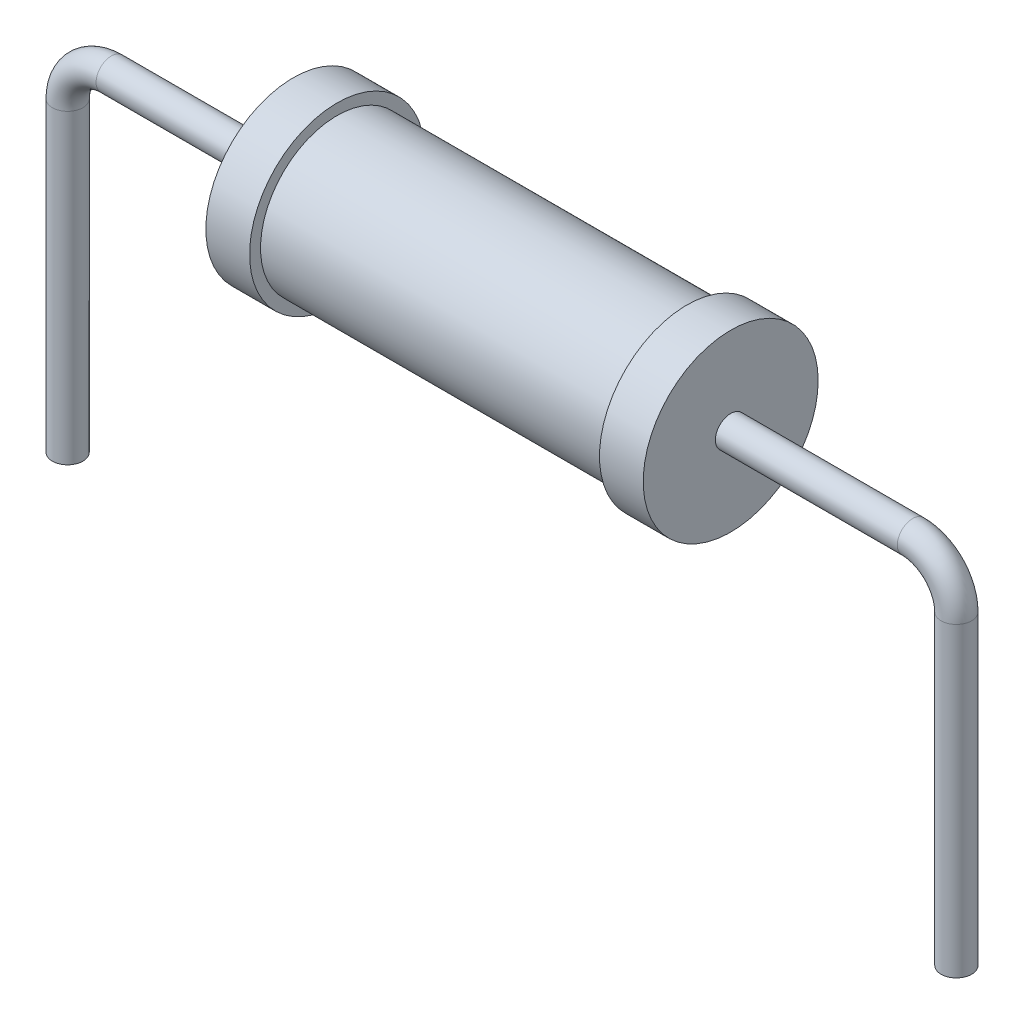
ISO-10303-21;
HEADER;
FILE_DESCRIPTION(('STEP AP214'),'2;1');
FILE_NAME('part.step','',(''),(''),'','','');
FILE_SCHEMA(('AUTOMOTIVE_DESIGN { 1 0 10303 214 1 1 1 1 }'));
ENDSEC;
DATA;
#1=APPLICATION_CONTEXT('core data for automotive mechanical design processes');
#2=APPLICATION_PROTOCOL_DEFINITION('international standard','automotive_design',2000,#1);
#3=PRODUCT_CONTEXT('',#1,'mechanical');
#4=PRODUCT('Part','Part','',(#3));
#5=PRODUCT_RELATED_PRODUCT_CATEGORY('part','',(#4));
#6=PRODUCT_DEFINITION_FORMATION('','',#4);
#7=PRODUCT_DEFINITION_CONTEXT('part definition',#1,'design');
#8=PRODUCT_DEFINITION('design','',#6,#7);
#9=PRODUCT_DEFINITION_SHAPE('','',#8);
#10=(LENGTH_UNIT() NAMED_UNIT(*) SI_UNIT(.MILLI.,.METRE.));
#11=(NAMED_UNIT(*) PLANE_ANGLE_UNIT() SI_UNIT($,.RADIAN.));
#12=(NAMED_UNIT(*) SI_UNIT($,.STERADIAN.) SOLID_ANGLE_UNIT());
#13=UNCERTAINTY_MEASURE_WITH_UNIT(LENGTH_MEASURE(1.E-05),#10,'distance_accuracy_value','');
#14=(GEOMETRIC_REPRESENTATION_CONTEXT(3) GLOBAL_UNCERTAINTY_ASSIGNED_CONTEXT((#13)) GLOBAL_UNIT_ASSIGNED_CONTEXT((#10,
#11,#12)) REPRESENTATION_CONTEXT('',''));
#15=CARTESIAN_POINT('',(0.,0.,0.));
#16=DIRECTION('',(0.,0.,1.));
#17=DIRECTION('',(1.,0.,0.));
#18=AXIS2_PLACEMENT_3D('',#15,#16,#17);
#19=CARTESIAN_POINT('',(5.,0.,0.));
#20=DIRECTION('',(-1.,0.,0.));
#21=DIRECTION('',(0.,0.,1.));
#22=AXIS2_PLACEMENT_3D('',#19,#20,#21);
#23=CYLINDRICAL_SURFACE('',#22,2.);
#24=CARTESIAN_POINT('',(-5.,0.,0.));
#25=DIRECTION('',(1.,0.,0.));
#26=DIRECTION('',(0.,0.,-1.));
#27=AXIS2_PLACEMENT_3D('',#24,#25,#26);
#28=CIRCLE('',#27,2.);
#29=CARTESIAN_POINT('',(-5.,0.,-2.));
#30=VERTEX_POINT('',#29);
#31=EDGE_CURVE('E81',#30,#30,#28,.T.);
#32=ORIENTED_EDGE('',*,*,#31,.T.);
#33=EDGE_LOOP('',(#32));
#34=FACE_BOUND('',#33,.T.);
#35=CARTESIAN_POINT('',(-4.,0.,0.));
#36=DIRECTION('',(1.,0.,0.));
#37=DIRECTION('',(0.,0.,-1.));
#38=AXIS2_PLACEMENT_3D('',#35,#36,#37);
#39=CIRCLE('',#38,2.);
#40=CARTESIAN_POINT('',(-4.,0.,-2.));
#41=VERTEX_POINT('',#40);
#42=EDGE_CURVE('E45',#41,#41,#39,.T.);
#43=ORIENTED_EDGE('',*,*,#42,.F.);
#44=EDGE_LOOP('',(#43));
#45=FACE_BOUND('',#44,.T.);
#46=ADVANCED_FACE('F41',(#34,#45),#23,.T.);
#47=CARTESIAN_POINT('',(-5.,0.,0.));
#48=DIRECTION('',(-1.,0.,0.));
#49=DIRECTION('',(0.,0.,-1.));
#50=AXIS2_PLACEMENT_3D('',#47,#48,#49);
#51=PLANE('',#50);
#52=CARTESIAN_POINT('',(-5.,0.,0.));
#53=DIRECTION('',(-1.,0.,0.));
#54=DIRECTION('',(0.,0.,1.));
#55=AXIS2_PLACEMENT_3D('',#52,#53,#54);
#56=CIRCLE('',#55,0.35);
#57=CARTESIAN_POINT('',(-5.,0.,0.35));
#58=VERTEX_POINT('',#57);
#59=EDGE_CURVE('E11',#58,#58,#56,.T.);
#60=ORIENTED_EDGE('',*,*,#59,.F.);
#61=EDGE_LOOP('',(#60));
#62=FACE_BOUND('',#61,.T.);
#63=ORIENTED_EDGE('',*,*,#31,.F.);
#64=EDGE_LOOP('',(#63));
#65=FACE_BOUND('',#64,.T.);
#66=ADVANCED_FACE('F105',(#62,#65),#51,.T.);
#67=CARTESIAN_POINT('',(-10.16,-0.999999999999999,0.));
#68=DIRECTION('',(0.,-1.,0.));
#69=DIRECTION('',(0.,0.,-1.));
#70=AXIS2_PLACEMENT_3D('',#67,#68,#69);
#71=CYLINDRICAL_SURFACE('',#70,0.35);
#72=CARTESIAN_POINT('',(-10.16,-0.999999999999999,0.));
#73=DIRECTION('',(0.,1.,0.));
#74=DIRECTION('',(0.,0.,-1.));
#75=AXIS2_PLACEMENT_3D('',#72,#73,#74);
#76=CIRCLE('',#75,0.35);
#77=CARTESIAN_POINT('',(-10.51,-0.999999999999999,0.));
#78=VERTEX_POINT('',#77);
#79=EDGE_CURVE('E75',#78,#78,#76,.T.);
#80=ORIENTED_EDGE('',*,*,#79,.F.);
#81=EDGE_LOOP('',(#80));
#82=FACE_BOUND('',#81,.T.);
#83=CARTESIAN_POINT('',(-10.16,-8.,0.));
#84=DIRECTION('',(0.,1.,0.));
#85=DIRECTION('',(0.,0.,-1.));
#86=AXIS2_PLACEMENT_3D('',#83,#84,#85);
#87=CIRCLE('',#86,0.35);
#88=CARTESIAN_POINT('',(-10.16,-8.,-0.35));
#89=VERTEX_POINT('',#88);
#90=EDGE_CURVE('E78',#89,#89,#87,.T.);
#91=ORIENTED_EDGE('',*,*,#90,.T.);
#92=EDGE_LOOP('',(#91));
#93=FACE_BOUND('',#92,.T.);
#94=ADVANCED_FACE('F110',(#82,#93),#71,.T.);
#95=CARTESIAN_POINT('',(-9.16,-1.,0.));
#96=DIRECTION('',(0.,0.,1.));
#97=DIRECTION('',(1.,0.,0.));
#98=AXIS2_PLACEMENT_3D('',#95,#96,#97);
#99=TOROIDAL_SURFACE('',#98,1.,0.35);
#100=CARTESIAN_POINT('',(-9.16,0.,0.));
#101=DIRECTION('',(1.,0.,0.));
#102=DIRECTION('',(0.,0.,-1.));
#103=AXIS2_PLACEMENT_3D('',#100,#101,#102);
#104=CIRCLE('',#103,0.35);
#105=CARTESIAN_POINT('',(-9.16,0.35,0.));
#106=VERTEX_POINT('',#105);
#107=EDGE_CURVE('E64',#106,#106,#104,.T.);
#108=CARTESIAN_POINT('',(-9.16,-1.,0.));
#109=DIRECTION('',(0.,0.,1.));
#110=DIRECTION('',(1.,0.,0.));
#111=AXIS2_PLACEMENT_3D('',#108,#109,#110);
#112=CIRCLE('',#111,1.35);
#113=EDGE_CURVE('',#106,#78,#112,.T.);
#114=ORIENTED_EDGE('',*,*,#107,.F.);
#115=ORIENTED_EDGE('',*,*,#79,.T.);
#116=ORIENTED_EDGE('',*,*,#113,.T.);
#117=ORIENTED_EDGE('',*,*,#113,.F.);
#118=EDGE_LOOP('',(#114,#116,#115,#117));
#119=FACE_BOUND('',#118,.T.);
#120=ADVANCED_FACE('F137',(#119),#99,.T.);
#121=CARTESIAN_POINT('',(-9.16,0.,0.));
#122=DIRECTION('',(1.,0.,0.));
#123=DIRECTION('',(0.,0.,-1.));
#124=AXIS2_PLACEMENT_3D('',#121,#122,#123);
#125=CYLINDRICAL_SURFACE('',#124,0.35);
#126=ORIENTED_EDGE('',*,*,#107,.T.);
#127=EDGE_LOOP('',(#126));
#128=FACE_BOUND('',#127,.T.);
#129=ORIENTED_EDGE('',*,*,#59,.T.);
#130=EDGE_LOOP('',(#129));
#131=FACE_BOUND('',#130,.T.);
#132=ADVANCED_FACE('F130',(#128,#131),#125,.T.);
#133=CARTESIAN_POINT('',(-10.16,-8.,0.));
#134=DIRECTION('',(0.,-1.,0.));
#135=DIRECTION('',(0.,0.,-1.));
#136=AXIS2_PLACEMENT_3D('',#133,#134,#135);
#137=PLANE('',#136);
#138=ORIENTED_EDGE('',*,*,#90,.F.);
#139=EDGE_LOOP('',(#138));
#140=FACE_BOUND('',#139,.T.);
#141=ADVANCED_FACE('F120',(#140),#137,.T.);
#142=CARTESIAN_POINT('',(-4.,0.,0.));
#143=DIRECTION('',(1.,0.,0.));
#144=DIRECTION('',(0.,0.,-1.));
#145=AXIS2_PLACEMENT_3D('',#142,#143,#144);
#146=PLANE('',#145);
#147=CARTESIAN_POINT('',(-4.,0.,0.));
#148=DIRECTION('',(1.,0.,0.));
#149=DIRECTION('',(0.,0.,-1.));
#150=AXIS2_PLACEMENT_3D('',#147,#148,#149);
#151=CIRCLE('',#150,1.75);
#152=CARTESIAN_POINT('',(-4.,0.,-1.75));
#153=VERTEX_POINT('',#152);
#154=EDGE_CURVE('E60',#153,#153,#151,.T.);
#155=ORIENTED_EDGE('',*,*,#154,.F.);
#156=EDGE_LOOP('',(#155));
#157=FACE_BOUND('',#156,.T.);
#158=ORIENTED_EDGE('',*,*,#42,.T.);
#159=EDGE_LOOP('',(#158));
#160=FACE_BOUND('',#159,.T.);
#161=ADVANCED_FACE('F117',(#157,#160),#146,.T.);
#162=CARTESIAN_POINT('',(4.,0.,0.));
#163=DIRECTION('',(1.,0.,0.));
#164=DIRECTION('',(0.,0.,-1.));
#165=AXIS2_PLACEMENT_3D('',#162,#163,#164);
#166=PLANE('',#165);
#167=CARTESIAN_POINT('',(4.,0.,0.));
#168=DIRECTION('',(1.,0.,0.));
#169=DIRECTION('',(0.,0.,-1.));
#170=AXIS2_PLACEMENT_3D('',#167,#168,#169);
#171=CIRCLE('',#170,1.75);
#172=CARTESIAN_POINT('',(4.,0.,-1.75));
#173=VERTEX_POINT('',#172);
#174=EDGE_CURVE('E66',#173,#173,#171,.T.);
#175=ORIENTED_EDGE('',*,*,#174,.T.);
#176=EDGE_LOOP('',(#175));
#177=FACE_BOUND('',#176,.T.);
#178=CARTESIAN_POINT('',(4.,0.,0.));
#179=DIRECTION('',(1.,0.,0.));
#180=DIRECTION('',(0.,0.,-1.));
#181=AXIS2_PLACEMENT_3D('',#178,#179,#180);
#182=CIRCLE('',#181,2.);
#183=CARTESIAN_POINT('',(4.,0.,-2.));
#184=VERTEX_POINT('',#183);
#185=EDGE_CURVE('E58',#184,#184,#182,.T.);
#186=ORIENTED_EDGE('',*,*,#185,.F.);
#187=EDGE_LOOP('',(#186));
#188=FACE_BOUND('',#187,.T.);
#189=ADVANCED_FACE('F119',(#177,#188),#166,.F.);
#190=CARTESIAN_POINT('',(-4.,0.,0.));
#191=DIRECTION('',(1.,0.,0.));
#192=DIRECTION('',(0.,0.,-1.));
#193=AXIS2_PLACEMENT_3D('',#190,#191,#192);
#194=CYLINDRICAL_SURFACE('',#193,1.75);
#195=ORIENTED_EDGE('',*,*,#154,.T.);
#196=EDGE_LOOP('',(#195));
#197=FACE_BOUND('',#196,.T.);
#198=ORIENTED_EDGE('',*,*,#174,.F.);
#199=EDGE_LOOP('',(#198));
#200=FACE_BOUND('',#199,.T.);
#201=ADVANCED_FACE('F127',(#197,#200),#194,.T.);
#202=CARTESIAN_POINT('',(10.16,-8.,0.));
#203=DIRECTION('',(0.,-1.,0.));
#204=DIRECTION('',(0.,0.,-1.));
#205=AXIS2_PLACEMENT_3D('',#202,#203,#204);
#206=PLANE('',#205);
#207=CARTESIAN_POINT('',(10.16,-8.,0.));
#208=DIRECTION('',(0.,-1.,0.));
#209=DIRECTION('',(0.,0.,-1.));
#210=AXIS2_PLACEMENT_3D('',#207,#208,#209);
#211=CIRCLE('',#210,0.35);
#212=CARTESIAN_POINT('',(10.16,-8.,-0.35));
#213=VERTEX_POINT('',#212);
#214=EDGE_CURVE('E89',#213,#213,#211,.T.);
#215=ORIENTED_EDGE('',*,*,#214,.T.);
#216=EDGE_LOOP('',(#215));
#217=FACE_BOUND('',#216,.T.);
#218=ADVANCED_FACE('F145',(#217),#206,.T.);
#219=CARTESIAN_POINT('',(10.16,-0.999999999999999,0.));
#220=DIRECTION('',(0.,-1.,0.));
#221=DIRECTION('',(0.,0.,-1.));
#222=AXIS2_PLACEMENT_3D('',#219,#220,#221);
#223=CYLINDRICAL_SURFACE('',#222,0.35);
#224=CARTESIAN_POINT('',(10.16,-0.999999999999999,0.));
#225=DIRECTION('',(0.,-1.,0.));
#226=DIRECTION('',(0.,0.,-1.));
#227=AXIS2_PLACEMENT_3D('',#224,#225,#226);
#228=CIRCLE('',#227,0.35);
#229=CARTESIAN_POINT('',(10.51,-0.999999999999999,0.));
#230=VERTEX_POINT('',#229);
#231=EDGE_CURVE('E86',#230,#230,#228,.T.);
#232=ORIENTED_EDGE('',*,*,#231,.T.);
#233=EDGE_LOOP('',(#232));
#234=FACE_BOUND('',#233,.T.);
#235=ORIENTED_EDGE('',*,*,#214,.F.);
#236=EDGE_LOOP('',(#235));
#237=FACE_BOUND('',#236,.T.);
#238=ADVANCED_FACE('F148',(#234,#237),#223,.T.);
#239=CARTESIAN_POINT('',(9.16,-1.,0.));
#240=DIRECTION('',(0.,0.,-1.));
#241=DIRECTION('',(-1.,0.,0.));
#242=AXIS2_PLACEMENT_3D('',#239,#240,#241);
#243=TOROIDAL_SURFACE('',#242,1.,0.35);
#244=CARTESIAN_POINT('',(9.16,0.,0.));
#245=DIRECTION('',(1.,0.,0.));
#246=DIRECTION('',(0.,0.,-1.));
#247=AXIS2_PLACEMENT_3D('',#244,#245,#246);
#248=CIRCLE('',#247,0.35);
#249=CARTESIAN_POINT('',(9.16,0.35,0.));
#250=VERTEX_POINT('',#249);
#251=EDGE_CURVE('E84',#250,#250,#248,.T.);
#252=CARTESIAN_POINT('',(9.16,-1.,0.));
#253=DIRECTION('',(0.,0.,-1.));
#254=DIRECTION('',(-1.,0.,0.));
#255=AXIS2_PLACEMENT_3D('',#252,#253,#254);
#256=CIRCLE('',#255,1.35);
#257=EDGE_CURVE('',#250,#230,#256,.T.);
#258=ORIENTED_EDGE('',*,*,#251,.T.);
#259=ORIENTED_EDGE('',*,*,#231,.F.);
#260=ORIENTED_EDGE('',*,*,#257,.T.);
#261=ORIENTED_EDGE('',*,*,#257,.F.);
#262=EDGE_LOOP('',(#258,#260,#259,#261));
#263=FACE_BOUND('',#262,.T.);
#264=ADVANCED_FACE('F151',(#263),#243,.T.);
#265=CARTESIAN_POINT('',(9.16,0.,0.));
#266=DIRECTION('',(-1.,0.,0.));
#267=DIRECTION('',(0.,0.,1.));
#268=AXIS2_PLACEMENT_3D('',#265,#266,#267);
#269=CYLINDRICAL_SURFACE('',#268,0.35);
#270=ORIENTED_EDGE('',*,*,#251,.F.);
#271=EDGE_LOOP('',(#270));
#272=FACE_BOUND('',#271,.T.);
#273=CARTESIAN_POINT('',(5.,0.,0.));
#274=DIRECTION('',(1.,0.,0.));
#275=DIRECTION('',(0.,0.,-1.));
#276=AXIS2_PLACEMENT_3D('',#273,#274,#275);
#277=CIRCLE('',#276,0.35);
#278=CARTESIAN_POINT('',(5.,0.,-0.35));
#279=VERTEX_POINT('',#278);
#280=EDGE_CURVE('E49',#279,#279,#277,.T.);
#281=ORIENTED_EDGE('',*,*,#280,.T.);
#282=EDGE_LOOP('',(#281));
#283=FACE_BOUND('',#282,.T.);
#284=ADVANCED_FACE('F102',(#272,#283),#269,.T.);
#285=CARTESIAN_POINT('',(5.,0.,0.));
#286=DIRECTION('',(1.,0.,0.));
#287=DIRECTION('',(0.,0.,-1.));
#288=AXIS2_PLACEMENT_3D('',#285,#286,#287);
#289=PLANE('',#288);
#290=ORIENTED_EDGE('',*,*,#280,.F.);
#291=EDGE_LOOP('',(#290));
#292=FACE_BOUND('',#291,.T.);
#293=CARTESIAN_POINT('',(5.,0.,0.));
#294=DIRECTION('',(1.,0.,0.));
#295=DIRECTION('',(0.,0.,-1.));
#296=AXIS2_PLACEMENT_3D('',#293,#294,#295);
#297=CIRCLE('',#296,2.);
#298=CARTESIAN_POINT('',(5.,0.,-2.));
#299=VERTEX_POINT('',#298);
#300=EDGE_CURVE('E54',#299,#299,#297,.T.);
#301=ORIENTED_EDGE('',*,*,#300,.T.);
#302=EDGE_LOOP('',(#301));
#303=FACE_BOUND('',#302,.T.);
#304=ADVANCED_FACE('F96',(#292,#303),#289,.T.);
#305=ORIENTED_EDGE('',*,*,#185,.T.);
#306=EDGE_LOOP('',(#305));
#307=FACE_BOUND('',#306,.T.);
#308=ORIENTED_EDGE('',*,*,#300,.F.);
#309=EDGE_LOOP('',(#308));
#310=FACE_BOUND('',#309,.T.);
#311=ADVANCED_FACE('F43',(#307,#310),#23,.T.);
#312=CLOSED_SHELL('',(#46,#66,#94,#120,#132,#141,#161,#189,#201,#218,#238,#264,#284,#304,#311));
#313=MANIFOLD_SOLID_BREP('B2',#312);
#314=ADVANCED_BREP_SHAPE_REPRESENTATION('',(#18,#313),#14);
#315=SHAPE_DEFINITION_REPRESENTATION(#9,#314);
ENDSEC;
END-ISO-10303-21;
